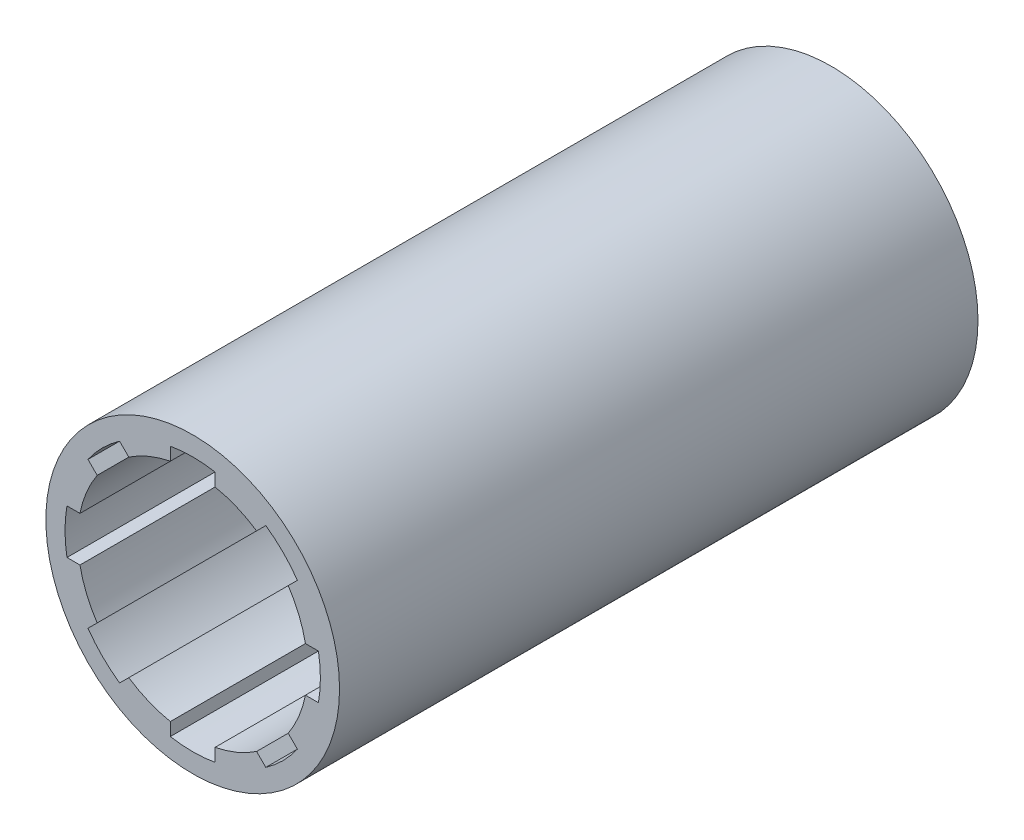
ISO-10303-21;
HEADER;
FILE_DESCRIPTION(('STEP AP214'),'2;1');
FILE_NAME('part.step','',(''),(''),'','','');
FILE_SCHEMA(('AUTOMOTIVE_DESIGN { 1 0 10303 214 1 1 1 1 }'));
ENDSEC;
DATA;
#1=APPLICATION_CONTEXT('core data for automotive mechanical design processes');
#2=APPLICATION_PROTOCOL_DEFINITION('international standard','automotive_design',2000,#1);
#3=PRODUCT_CONTEXT('',#1,'mechanical');
#4=PRODUCT('Part','Part','',(#3));
#5=PRODUCT_RELATED_PRODUCT_CATEGORY('part','',(#4));
#6=PRODUCT_DEFINITION_FORMATION('','',#4);
#7=PRODUCT_DEFINITION_CONTEXT('part definition',#1,'design');
#8=PRODUCT_DEFINITION('design','',#6,#7);
#9=PRODUCT_DEFINITION_SHAPE('','',#8);
#10=(LENGTH_UNIT() NAMED_UNIT(*) SI_UNIT(.MILLI.,.METRE.));
#11=(NAMED_UNIT(*) PLANE_ANGLE_UNIT() SI_UNIT($,.RADIAN.));
#12=(NAMED_UNIT(*) SI_UNIT($,.STERADIAN.) SOLID_ANGLE_UNIT());
#13=UNCERTAINTY_MEASURE_WITH_UNIT(LENGTH_MEASURE(1.E-05),#10,'distance_accuracy_value','');
#14=(GEOMETRIC_REPRESENTATION_CONTEXT(3) GLOBAL_UNCERTAINTY_ASSIGNED_CONTEXT((#13)) GLOBAL_UNIT_ASSIGNED_CONTEXT((#10,
#11,#12)) REPRESENTATION_CONTEXT('',''));
#15=CARTESIAN_POINT('',(0.,0.,0.));
#16=DIRECTION('',(0.,0.,1.));
#17=DIRECTION('',(1.,0.,0.));
#18=AXIS2_PLACEMENT_3D('',#15,#16,#17);
#19=CARTESIAN_POINT('',(0.,0.,100.));
#20=DIRECTION('',(0.,0.,-1.));
#21=DIRECTION('',(-1.,0.,0.));
#22=AXIS2_PLACEMENT_3D('',#19,#20,#21);
#23=CYLINDRICAL_SURFACE('',#22,20.);
#24=CARTESIAN_POINT('',(0.,0.,100.));
#25=DIRECTION('',(0.,0.,1.));
#26=DIRECTION('',(1.,0.,0.));
#27=AXIS2_PLACEMENT_3D('',#24,#25,#26);
#28=CIRCLE('',#27,20.);
#29=CARTESIAN_POINT('',(-19.6913686675158,3.49999999999676,100.));
#30=VERTEX_POINT('',#29);
#31=CARTESIAN_POINT('',(-19.6913686675153,-3.49999999999976,100.));
#32=VERTEX_POINT('',#31);
#33=EDGE_CURVE('E458',#30,#32,#28,.T.);
#34=ORIENTED_EDGE('',*,*,#33,.T.);
#35=DIRECTION('',(0.,0.,1.));
#36=VECTOR('',#35,1.);
#37=CARTESIAN_POINT('',(-19.6913686675153,-3.49999999999976,0.));
#38=LINE('',#37,#36);
#39=CARTESIAN_POINT('',(-19.6913686675153,-3.49999999999976,0.));
#40=VERTEX_POINT('',#39);
#41=EDGE_CURVE('E259',#40,#32,#38,.T.);
#42=ORIENTED_EDGE('',*,*,#41,.F.);
#43=CARTESIAN_POINT('',(0.,0.,0.));
#44=DIRECTION('',(0.,0.,1.));
#45=DIRECTION('',(1.,0.,0.));
#46=AXIS2_PLACEMENT_3D('',#43,#44,#45);
#47=CIRCLE('',#46,20.);
#48=CARTESIAN_POINT('',(-19.6913686675158,3.49999999999676,0.));
#49=VERTEX_POINT('',#48);
#50=EDGE_CURVE('E247',#49,#40,#47,.T.);
#51=ORIENTED_EDGE('',*,*,#50,.F.);
#52=DIRECTION('',(0.,0.,1.));
#53=VECTOR('',#52,1.);
#54=CARTESIAN_POINT('',(-19.6913686675158,3.49999999999676,0.));
#55=LINE('',#54,#53);
#56=EDGE_CURVE('E450',#49,#30,#55,.T.);
#57=ORIENTED_EDGE('',*,*,#56,.T.);
#58=EDGE_LOOP('',(#34,#42,#51,#57));
#59=FACE_BOUND('',#58,.T.);
#60=ADVANCED_FACE('F34',(#59),#23,.F.);
#61=DIRECTION('',(0.,0.,1.));
#62=VECTOR('',#61,1.);
#63=CARTESIAN_POINT('',(-16.3987740497953,-11.4490265814941,0.));
#64=LINE('',#63,#62);
#65=CARTESIAN_POINT('',(-16.3987740497953,-11.4490265814941,0.));
#66=VERTEX_POINT('',#65);
#67=CARTESIAN_POINT('',(-16.3987740497953,-11.4490265814941,100.));
#68=VERTEX_POINT('',#67);
#69=EDGE_CURVE('E274',#66,#68,#64,.T.);
#70=ORIENTED_EDGE('',*,*,#69,.T.);
#71=CARTESIAN_POINT('',(-11.4490265814916,-16.3987740497971,100.));
#72=VERTEX_POINT('',#71);
#73=EDGE_CURVE('E461',#68,#72,#28,.T.);
#74=ORIENTED_EDGE('',*,*,#73,.T.);
#75=DIRECTION('',(0.,0.,1.));
#76=VECTOR('',#75,1.);
#77=CARTESIAN_POINT('',(-11.4490265814916,-16.3987740497971,0.));
#78=LINE('',#77,#76);
#79=CARTESIAN_POINT('',(-11.4490265814916,-16.3987740497971,0.));
#80=VERTEX_POINT('',#79);
#81=EDGE_CURVE('E297',#80,#72,#78,.T.);
#82=ORIENTED_EDGE('',*,*,#81,.F.);
#83=EDGE_CURVE('E463',#66,#80,#47,.T.);
#84=ORIENTED_EDGE('',*,*,#83,.F.);
#85=EDGE_LOOP('',(#70,#74,#82,#84));
#86=FACE_BOUND('',#85,.T.);
#87=ADVANCED_FACE('F547',(#86),#23,.F.);
#88=DIRECTION('',(0.,0.,1.));
#89=VECTOR('',#88,1.);
#90=CARTESIAN_POINT('',(-3.49999999999676,-19.6913686675158,0.));
#91=LINE('',#90,#89);
#92=CARTESIAN_POINT('',(-3.49999999999676,-19.6913686675158,0.));
#93=VERTEX_POINT('',#92);
#94=CARTESIAN_POINT('',(-3.49999999999676,-19.6913686675158,100.));
#95=VERTEX_POINT('',#94);
#96=EDGE_CURVE('E294',#93,#95,#91,.T.);
#97=ORIENTED_EDGE('',*,*,#96,.T.);
#98=CARTESIAN_POINT('',(3.49999999999975,-19.6913686675153,100.));
#99=VERTEX_POINT('',#98);
#100=EDGE_CURVE('E491',#95,#99,#28,.T.);
#101=ORIENTED_EDGE('',*,*,#100,.T.);
#102=DIRECTION('',(0.,0.,1.));
#103=VECTOR('',#102,1.);
#104=CARTESIAN_POINT('',(3.49999999999975,-19.6913686675153,0.));
#105=LINE('',#104,#103);
#106=CARTESIAN_POINT('',(3.49999999999975,-19.6913686675153,0.));
#107=VERTEX_POINT('',#106);
#108=EDGE_CURVE('E323',#107,#99,#105,.T.);
#109=ORIENTED_EDGE('',*,*,#108,.F.);
#110=EDGE_CURVE('E465',#93,#107,#47,.T.);
#111=ORIENTED_EDGE('',*,*,#110,.F.);
#112=EDGE_LOOP('',(#97,#101,#109,#111));
#113=FACE_BOUND('',#112,.T.);
#114=ADVANCED_FACE('F489',(#113),#23,.F.);
#115=DIRECTION('',(0.,0.,1.));
#116=VECTOR('',#115,1.);
#117=CARTESIAN_POINT('',(11.4490265814941,-16.3987740497954,0.));
#118=LINE('',#117,#116);
#119=CARTESIAN_POINT('',(11.4490265814941,-16.3987740497954,0.));
#120=VERTEX_POINT('',#119);
#121=CARTESIAN_POINT('',(11.4490265814941,-16.3987740497954,100.));
#122=VERTEX_POINT('',#121);
#123=EDGE_CURVE('E320',#120,#122,#118,.T.);
#124=ORIENTED_EDGE('',*,*,#123,.T.);
#125=CARTESIAN_POINT('',(16.3987740497971,-11.4490265814916,100.));
#126=VERTEX_POINT('',#125);
#127=EDGE_CURVE('E493',#122,#126,#28,.T.);
#128=ORIENTED_EDGE('',*,*,#127,.T.);
#129=DIRECTION('',(0.,0.,1.));
#130=VECTOR('',#129,1.);
#131=CARTESIAN_POINT('',(16.3987740497971,-11.4490265814916,0.));
#132=LINE('',#131,#130);
#133=CARTESIAN_POINT('',(16.3987740497971,-11.4490265814916,0.));
#134=VERTEX_POINT('',#133);
#135=EDGE_CURVE('E349',#134,#126,#132,.T.);
#136=ORIENTED_EDGE('',*,*,#135,.F.);
#137=EDGE_CURVE('E475',#120,#134,#47,.T.);
#138=ORIENTED_EDGE('',*,*,#137,.F.);
#139=EDGE_LOOP('',(#124,#128,#136,#138));
#140=FACE_BOUND('',#139,.T.);
#141=ADVANCED_FACE('F597',(#140),#23,.F.);
#142=DIRECTION('',(0.,0.,1.));
#143=VECTOR('',#142,1.);
#144=CARTESIAN_POINT('',(19.6913686675158,-3.49999999999676,0.));
#145=LINE('',#144,#143);
#146=CARTESIAN_POINT('',(19.6913686675158,-3.49999999999676,0.));
#147=VERTEX_POINT('',#146);
#148=CARTESIAN_POINT('',(19.6913686675158,-3.49999999999676,100.));
#149=VERTEX_POINT('',#148);
#150=EDGE_CURVE('E346',#147,#149,#145,.T.);
#151=ORIENTED_EDGE('',*,*,#150,.T.);
#152=CARTESIAN_POINT('',(19.6913686675153,3.49999999999975,100.));
#153=VERTEX_POINT('',#152);
#154=EDGE_CURVE('E494',#149,#153,#28,.T.);
#155=ORIENTED_EDGE('',*,*,#154,.T.);
#156=DIRECTION('',(0.,0.,1.));
#157=VECTOR('',#156,1.);
#158=CARTESIAN_POINT('',(19.6913686675153,3.49999999999975,0.));
#159=LINE('',#158,#157);
#160=CARTESIAN_POINT('',(19.6913686675153,3.49999999999975,0.));
#161=VERTEX_POINT('',#160);
#162=EDGE_CURVE('E375',#161,#153,#159,.T.);
#163=ORIENTED_EDGE('',*,*,#162,.F.);
#164=EDGE_CURVE('E472',#147,#161,#47,.T.);
#165=ORIENTED_EDGE('',*,*,#164,.F.);
#166=EDGE_LOOP('',(#151,#155,#163,#165));
#167=FACE_BOUND('',#166,.T.);
#168=ADVANCED_FACE('F593',(#167),#23,.F.);
#169=DIRECTION('',(0.,0.,1.));
#170=VECTOR('',#169,1.);
#171=CARTESIAN_POINT('',(16.3987740497954,11.4490265814941,0.));
#172=LINE('',#171,#170);
#173=CARTESIAN_POINT('',(16.3987740497954,11.4490265814941,0.));
#174=VERTEX_POINT('',#173);
#175=CARTESIAN_POINT('',(16.3987740497954,11.4490265814941,100.));
#176=VERTEX_POINT('',#175);
#177=EDGE_CURVE('E372',#174,#176,#172,.T.);
#178=ORIENTED_EDGE('',*,*,#177,.T.);
#179=CARTESIAN_POINT('',(11.4490265814916,16.3987740497971,100.));
#180=VERTEX_POINT('',#179);
#181=EDGE_CURVE('E498',#176,#180,#28,.T.);
#182=ORIENTED_EDGE('',*,*,#181,.T.);
#183=DIRECTION('',(0.,0.,1.));
#184=VECTOR('',#183,1.);
#185=CARTESIAN_POINT('',(11.4490265814916,16.3987740497971,0.));
#186=LINE('',#185,#184);
#187=CARTESIAN_POINT('',(11.4490265814916,16.3987740497971,0.));
#188=VERTEX_POINT('',#187);
#189=EDGE_CURVE('E401',#188,#180,#186,.T.);
#190=ORIENTED_EDGE('',*,*,#189,.F.);
#191=EDGE_CURVE('E469',#174,#188,#47,.T.);
#192=ORIENTED_EDGE('',*,*,#191,.F.);
#193=EDGE_LOOP('',(#178,#182,#190,#192));
#194=FACE_BOUND('',#193,.T.);
#195=ADVANCED_FACE('F586',(#194),#23,.F.);
#196=DIRECTION('',(0.,0.,1.));
#197=VECTOR('',#196,1.);
#198=CARTESIAN_POINT('',(3.49999999999676,19.6913686675158,0.));
#199=LINE('',#198,#197);
#200=CARTESIAN_POINT('',(3.49999999999676,19.6913686675158,0.));
#201=VERTEX_POINT('',#200);
#202=CARTESIAN_POINT('',(3.49999999999676,19.6913686675158,100.));
#203=VERTEX_POINT('',#202);
#204=EDGE_CURVE('E398',#201,#203,#199,.T.);
#205=ORIENTED_EDGE('',*,*,#204,.T.);
#206=CARTESIAN_POINT('',(-3.49999999999975,19.6913686675153,100.));
#207=VERTEX_POINT('',#206);
#208=EDGE_CURVE('E464',#203,#207,#28,.T.);
#209=ORIENTED_EDGE('',*,*,#208,.T.);
#210=DIRECTION('',(0.,0.,1.));
#211=VECTOR('',#210,1.);
#212=CARTESIAN_POINT('',(-3.49999999999975,19.6913686675153,0.));
#213=LINE('',#212,#211);
#214=CARTESIAN_POINT('',(-3.49999999999975,19.6913686675153,0.));
#215=VERTEX_POINT('',#214);
#216=EDGE_CURVE('E427',#215,#207,#213,.T.);
#217=ORIENTED_EDGE('',*,*,#216,.F.);
#218=EDGE_CURVE('E466',#201,#215,#47,.T.);
#219=ORIENTED_EDGE('',*,*,#218,.F.);
#220=EDGE_LOOP('',(#205,#209,#217,#219));
#221=FACE_BOUND('',#220,.T.);
#222=ADVANCED_FACE('F507',(#221),#23,.F.);
#223=CARTESIAN_POINT('',(0.,0.,100.));
#224=DIRECTION('',(0.,0.,1.));
#225=DIRECTION('',(1.,0.,0.));
#226=AXIS2_PLACEMENT_3D('',#223,#224,#225);
#227=PLANE('',#226);
#228=CARTESIAN_POINT('',(0.,0.,100.));
#229=DIRECTION('',(0.,0.,1.));
#230=DIRECTION('',(1.,0.,0.));
#231=AXIS2_PLACEMENT_3D('',#228,#229,#230);
#232=CIRCLE('',#231,23.);
#233=CARTESIAN_POINT('',(23.,0.,100.));
#234=VERTEX_POINT('',#233);
#235=EDGE_CURVE('E11',#234,#234,#232,.T.);
#236=ORIENTED_EDGE('',*,*,#235,.T.);
#237=EDGE_LOOP('',(#236));
#238=FACE_BOUND('',#237,.T.);
#239=ORIENTED_EDGE('',*,*,#33,.F.);
#240=DIRECTION('',(1.,0.,0.));
#241=VECTOR('',#240,1.);
#242=CARTESIAN_POINT('',(0.,3.49999999999677,100.));
#243=LINE('',#242,#241);
#244=CARTESIAN_POINT('',(-17.6564435830091,3.49999999999676,100.));
#245=VERTEX_POINT('',#244);
#246=EDGE_CURVE('E435',#30,#245,#243,.T.);
#247=ORIENTED_EDGE('',*,*,#246,.T.);
#248=CARTESIAN_POINT('',(0.,0.,100.));
#249=DIRECTION('',(0.,0.,1.));
#250=DIRECTION('',(1.,0.,0.));
#251=AXIS2_PLACEMENT_3D('',#248,#249,#250);
#252=CIRCLE('',#251,17.9999999999989);
#253=CARTESIAN_POINT('',(-14.9598647233358,10.0101172550303,100.));
#254=VERTEX_POINT('',#253);
#255=EDGE_CURVE('E423',#254,#245,#252,.T.);
#256=ORIENTED_EDGE('',*,*,#255,.F.);
#257=DIRECTION('',(0.707106781186548,-0.707106781186547,0.));
#258=VECTOR('',#257,1.);
#259=CARTESIAN_POINT('',(-2.47487373415274,-2.47487373415274,100.));
#260=LINE('',#259,#258);
#261=CARTESIAN_POINT('',(-16.3987740497971,11.4490265814916,100.));
#262=VERTEX_POINT('',#261);
#263=EDGE_CURVE('E443',#262,#254,#260,.T.);
#264=ORIENTED_EDGE('',*,*,#263,.F.);
#265=CARTESIAN_POINT('',(-11.4490265814941,16.3987740497954,100.));
#266=VERTEX_POINT('',#265);
#267=EDGE_CURVE('E462',#266,#262,#28,.T.);
#268=ORIENTED_EDGE('',*,*,#267,.F.);
#269=DIRECTION('',(0.707106781186548,-0.707106781186547,0.));
#270=VECTOR('',#269,1.);
#271=CARTESIAN_POINT('',(2.47487373415063,2.47487373415063,100.));
#272=LINE('',#271,#270);
#273=CARTESIAN_POINT('',(-10.0101172550328,14.9598647233341,100.));
#274=VERTEX_POINT('',#273);
#275=EDGE_CURVE('E409',#266,#274,#272,.T.);
#276=ORIENTED_EDGE('',*,*,#275,.T.);
#277=CARTESIAN_POINT('',(0.,0.,100.));
#278=DIRECTION('',(0.,0.,1.));
#279=DIRECTION('',(1.,0.,0.));
#280=AXIS2_PLACEMENT_3D('',#277,#278,#279);
#281=CIRCLE('',#280,17.9999999999989);
#282=CARTESIAN_POINT('',(-3.49999999999975,17.6564435830085,100.));
#283=VERTEX_POINT('',#282);
#284=EDGE_CURVE('E397',#283,#274,#281,.T.);
#285=ORIENTED_EDGE('',*,*,#284,.F.);
#286=DIRECTION('',(0.,-1.,0.));
#287=VECTOR('',#286,1.);
#288=CARTESIAN_POINT('',(-3.49999999999975,0.,100.));
#289=LINE('',#288,#287);
#290=EDGE_CURVE('E417',#207,#283,#289,.T.);
#291=ORIENTED_EDGE('',*,*,#290,.F.);
#292=ORIENTED_EDGE('',*,*,#208,.F.);
#293=DIRECTION('',(0.,-1.,0.));
#294=VECTOR('',#293,1.);
#295=CARTESIAN_POINT('',(3.49999999999677,0.,100.));
#296=LINE('',#295,#294);
#297=CARTESIAN_POINT('',(3.49999999999676,17.6564435830091,100.));
#298=VERTEX_POINT('',#297);
#299=EDGE_CURVE('E383',#203,#298,#296,.T.);
#300=ORIENTED_EDGE('',*,*,#299,.T.);
#301=CARTESIAN_POINT('',(0.,0.,100.));
#302=DIRECTION('',(0.,0.,1.));
#303=DIRECTION('',(1.,0.,0.));
#304=AXIS2_PLACEMENT_3D('',#301,#302,#303);
#305=CIRCLE('',#304,17.9999999999989);
#306=CARTESIAN_POINT('',(10.0101172550303,14.9598647233358,100.));
#307=VERTEX_POINT('',#306);
#308=EDGE_CURVE('E371',#307,#298,#305,.T.);
#309=ORIENTED_EDGE('',*,*,#308,.F.);
#310=DIRECTION('',(-0.707106781186547,-0.707106781186548,0.));
#311=VECTOR('',#310,1.);
#312=CARTESIAN_POINT('',(-2.47487373415274,2.47487373415273,100.));
#313=LINE('',#312,#311);
#314=EDGE_CURVE('E391',#180,#307,#313,.T.);
#315=ORIENTED_EDGE('',*,*,#314,.F.);
#316=ORIENTED_EDGE('',*,*,#181,.F.);
#317=DIRECTION('',(-0.707106781186547,-0.707106781186548,0.));
#318=VECTOR('',#317,1.);
#319=CARTESIAN_POINT('',(2.47487373415065,-2.47487373415064,100.));
#320=LINE('',#319,#318);
#321=CARTESIAN_POINT('',(14.9598647233341,10.0101172550328,100.));
#322=VERTEX_POINT('',#321);
#323=EDGE_CURVE('E357',#176,#322,#320,.T.);
#324=ORIENTED_EDGE('',*,*,#323,.T.);
#325=CARTESIAN_POINT('',(0.,0.,100.));
#326=DIRECTION('',(0.,0.,1.));
#327=DIRECTION('',(1.,0.,0.));
#328=AXIS2_PLACEMENT_3D('',#325,#326,#327);
#329=CIRCLE('',#328,17.9999999999989);
#330=CARTESIAN_POINT('',(17.6564435830085,3.49999999999975,100.));
#331=VERTEX_POINT('',#330);
#332=EDGE_CURVE('E345',#331,#322,#329,.T.);
#333=ORIENTED_EDGE('',*,*,#332,.F.);
#334=DIRECTION('',(-1.,0.,0.));
#335=VECTOR('',#334,1.);
#336=CARTESIAN_POINT('',(0.,3.49999999999975,100.));
#337=LINE('',#336,#335);
#338=EDGE_CURVE('E365',#153,#331,#337,.T.);
#339=ORIENTED_EDGE('',*,*,#338,.F.);
#340=ORIENTED_EDGE('',*,*,#154,.F.);
#341=DIRECTION('',(-1.,0.,0.));
#342=VECTOR('',#341,1.);
#343=CARTESIAN_POINT('',(0.,-3.49999999999677,100.));
#344=LINE('',#343,#342);
#345=CARTESIAN_POINT('',(17.6564435830091,-3.49999999999676,100.));
#346=VERTEX_POINT('',#345);
#347=EDGE_CURVE('E331',#149,#346,#344,.T.);
#348=ORIENTED_EDGE('',*,*,#347,.T.);
#349=CARTESIAN_POINT('',(0.,0.,100.));
#350=DIRECTION('',(0.,0.,1.));
#351=DIRECTION('',(1.,0.,0.));
#352=AXIS2_PLACEMENT_3D('',#349,#350,#351);
#353=CIRCLE('',#352,17.9999999999989);
#354=CARTESIAN_POINT('',(14.9598647233358,-10.0101172550303,100.));
#355=VERTEX_POINT('',#354);
#356=EDGE_CURVE('E319',#355,#346,#353,.T.);
#357=ORIENTED_EDGE('',*,*,#356,.F.);
#358=DIRECTION('',(-0.707106781186548,0.707106781186547,0.));
#359=VECTOR('',#358,1.);
#360=CARTESIAN_POINT('',(2.47487373415272,2.47487373415273,100.));
#361=LINE('',#360,#359);
#362=EDGE_CURVE('E339',#126,#355,#361,.T.);
#363=ORIENTED_EDGE('',*,*,#362,.F.);
#364=ORIENTED_EDGE('',*,*,#127,.F.);
#365=DIRECTION('',(-0.707106781186548,0.707106781186547,0.));
#366=VECTOR('',#365,1.);
#367=CARTESIAN_POINT('',(-2.47487373415064,-2.47487373415065,100.));
#368=LINE('',#367,#366);
#369=CARTESIAN_POINT('',(10.0101172550328,-14.9598647233341,100.));
#370=VERTEX_POINT('',#369);
#371=EDGE_CURVE('E305',#122,#370,#368,.T.);
#372=ORIENTED_EDGE('',*,*,#371,.T.);
#373=CARTESIAN_POINT('',(0.,0.,100.));
#374=DIRECTION('',(0.,0.,1.));
#375=DIRECTION('',(1.,0.,0.));
#376=AXIS2_PLACEMENT_3D('',#373,#374,#375);
#377=CIRCLE('',#376,17.9999999999989);
#378=CARTESIAN_POINT('',(3.49999999999975,-17.6564435830085,100.));
#379=VERTEX_POINT('',#378);
#380=EDGE_CURVE('E293',#379,#370,#377,.T.);
#381=ORIENTED_EDGE('',*,*,#380,.F.);
#382=DIRECTION('',(0.,1.,0.));
#383=VECTOR('',#382,1.);
#384=CARTESIAN_POINT('',(3.49999999999975,0.,100.));
#385=LINE('',#384,#383);
#386=EDGE_CURVE('E313',#99,#379,#385,.T.);
#387=ORIENTED_EDGE('',*,*,#386,.F.);
#388=ORIENTED_EDGE('',*,*,#100,.F.);
#389=DIRECTION('',(0.,1.,0.));
#390=VECTOR('',#389,1.);
#391=CARTESIAN_POINT('',(-3.49999999999676,0.,100.));
#392=LINE('',#391,#390);
#393=CARTESIAN_POINT('',(-3.49999999999676,-17.6564435830091,100.));
#394=VERTEX_POINT('',#393);
#395=EDGE_CURVE('E281',#95,#394,#392,.T.);
#396=ORIENTED_EDGE('',*,*,#395,.T.);
#397=CARTESIAN_POINT('',(0.,0.,100.));
#398=DIRECTION('',(0.,0.,1.));
#399=DIRECTION('',(1.,0.,0.));
#400=AXIS2_PLACEMENT_3D('',#397,#398,#399);
#401=CIRCLE('',#400,17.9999999999989);
#402=CARTESIAN_POINT('',(-10.0101172550303,-14.9598647233358,100.));
#403=VERTEX_POINT('',#402);
#404=EDGE_CURVE('E273',#403,#394,#401,.T.);
#405=ORIENTED_EDGE('',*,*,#404,.F.);
#406=DIRECTION('',(0.707106781186547,0.707106781186548,0.));
#407=VECTOR('',#406,1.);
#408=CARTESIAN_POINT('',(2.47487373415273,-2.47487373415272,100.));
#409=LINE('',#408,#407);
#410=EDGE_CURVE('E287',#72,#403,#409,.T.);
#411=ORIENTED_EDGE('',*,*,#410,.F.);
#412=ORIENTED_EDGE('',*,*,#73,.F.);
#413=DIRECTION('',(0.707106781186546,0.707106781186549,0.));
#414=VECTOR('',#413,1.);
#415=CARTESIAN_POINT('',(-2.47487373415065,2.47487373415064,100.));
#416=LINE('',#415,#414);
#417=CARTESIAN_POINT('',(-14.9598647233341,-10.0101172550328,100.));
#418=VERTEX_POINT('',#417);
#419=EDGE_CURVE('E263',#68,#418,#416,.T.);
#420=ORIENTED_EDGE('',*,*,#419,.T.);
#421=CARTESIAN_POINT('',(0.,0.,100.));
#422=DIRECTION('',(0.,0.,1.));
#423=DIRECTION('',(1.,0.,0.));
#424=AXIS2_PLACEMENT_3D('',#421,#422,#423);
#425=CIRCLE('',#424,17.9999999999989);
#426=CARTESIAN_POINT('',(-17.6564435830085,-3.49999999999975,100.));
#427=VERTEX_POINT('',#426);
#428=EDGE_CURVE('E269',#427,#418,#425,.T.);
#429=ORIENTED_EDGE('',*,*,#428,.F.);
#430=DIRECTION('',(1.,0.,0.));
#431=VECTOR('',#430,1.);
#432=CARTESIAN_POINT('',(0.,-3.49999999999975,100.));
#433=LINE('',#432,#431);
#434=EDGE_CURVE('E255',#32,#427,#433,.T.);
#435=ORIENTED_EDGE('',*,*,#434,.F.);
#436=EDGE_LOOP('',(#239,#247,#256,#264,#268,#276,#285,#291,#292,#300,#309,#315,#316,#324,#333,
#339,#340,#348,#357,#363,#364,#372,#381,#387,#388,#396,#405,#411,#412,#420,#429,#435));
#437=FACE_BOUND('',#436,.T.);
#438=ADVANCED_FACE('F515',(#238,#437),#227,.T.);
#439=CARTESIAN_POINT('',(0.,0.,0.));
#440=DIRECTION('',(0.,0.,1.));
#441=DIRECTION('',(1.,0.,0.));
#442=AXIS2_PLACEMENT_3D('',#439,#440,#441);
#443=PLANE('',#442);
#444=CARTESIAN_POINT('',(0.,0.,0.));
#445=DIRECTION('',(0.,0.,1.));
#446=DIRECTION('',(1.,0.,0.));
#447=AXIS2_PLACEMENT_3D('',#444,#445,#446);
#448=CIRCLE('',#447,23.);
#449=CARTESIAN_POINT('',(23.,0.,0.));
#450=VERTEX_POINT('',#449);
#451=EDGE_CURVE('E38',#450,#450,#448,.T.);
#452=ORIENTED_EDGE('',*,*,#451,.F.);
#453=EDGE_LOOP('',(#452));
#454=FACE_BOUND('',#453,.T.);
#455=ORIENTED_EDGE('',*,*,#50,.T.);
#456=DIRECTION('',(1.,0.,0.));
#457=VECTOR('',#456,1.);
#458=CARTESIAN_POINT('',(0.,-3.49999999999975,0.));
#459=LINE('',#458,#457);
#460=CARTESIAN_POINT('',(-17.6564435830085,-3.49999999999975,0.));
#461=VERTEX_POINT('',#460);
#462=EDGE_CURVE('E240',#40,#461,#459,.T.);
#463=ORIENTED_EDGE('',*,*,#462,.T.);
#464=CARTESIAN_POINT('',(0.,0.,0.));
#465=DIRECTION('',(0.,0.,1.));
#466=DIRECTION('',(1.,0.,0.));
#467=AXIS2_PLACEMENT_3D('',#464,#465,#466);
#468=CIRCLE('',#467,17.9999999999989);
#469=CARTESIAN_POINT('',(-14.9598647233341,-10.0101172550328,0.));
#470=VERTEX_POINT('',#469);
#471=EDGE_CURVE('E244',#461,#470,#468,.T.);
#472=ORIENTED_EDGE('',*,*,#471,.T.);
#473=DIRECTION('',(0.707106781186546,0.707106781186549,0.));
#474=VECTOR('',#473,1.);
#475=CARTESIAN_POINT('',(-2.47487373415065,2.47487373415064,0.));
#476=LINE('',#475,#474);
#477=EDGE_CURVE('E49',#66,#470,#476,.T.);
#478=ORIENTED_EDGE('',*,*,#477,.F.);
#479=ORIENTED_EDGE('',*,*,#83,.T.);
#480=DIRECTION('',(0.707106781186547,0.707106781186548,0.));
#481=VECTOR('',#480,1.);
#482=CARTESIAN_POINT('',(2.47487373415273,-2.47487373415272,0.));
#483=LINE('',#482,#481);
#484=CARTESIAN_POINT('',(-10.0101172550303,-14.9598647233358,0.));
#485=VERTEX_POINT('',#484);
#486=EDGE_CURVE('E280',#80,#485,#483,.T.);
#487=ORIENTED_EDGE('',*,*,#486,.T.);
#488=CARTESIAN_POINT('',(0.,0.,0.));
#489=DIRECTION('',(0.,0.,1.));
#490=DIRECTION('',(1.,0.,0.));
#491=AXIS2_PLACEMENT_3D('',#488,#489,#490);
#492=CIRCLE('',#491,17.9999999999989);
#493=CARTESIAN_POINT('',(-3.49999999999676,-17.6564435830091,0.));
#494=VERTEX_POINT('',#493);
#495=EDGE_CURVE('E278',#485,#494,#492,.T.);
#496=ORIENTED_EDGE('',*,*,#495,.T.);
#497=DIRECTION('',(0.,1.,0.));
#498=VECTOR('',#497,1.);
#499=CARTESIAN_POINT('',(-3.49999999999676,0.,0.));
#500=LINE('',#499,#498);
#501=EDGE_CURVE('E56',#93,#494,#500,.T.);
#502=ORIENTED_EDGE('',*,*,#501,.F.);
#503=ORIENTED_EDGE('',*,*,#110,.T.);
#504=DIRECTION('',(0.,1.,0.));
#505=VECTOR('',#504,1.);
#506=CARTESIAN_POINT('',(3.49999999999975,0.,0.));
#507=LINE('',#506,#505);
#508=CARTESIAN_POINT('',(3.49999999999975,-17.6564435830085,0.));
#509=VERTEX_POINT('',#508);
#510=EDGE_CURVE('E304',#107,#509,#507,.T.);
#511=ORIENTED_EDGE('',*,*,#510,.T.);
#512=CARTESIAN_POINT('',(0.,0.,0.));
#513=DIRECTION('',(0.,0.,1.));
#514=DIRECTION('',(1.,0.,0.));
#515=AXIS2_PLACEMENT_3D('',#512,#513,#514);
#516=CIRCLE('',#515,17.9999999999989);
#517=CARTESIAN_POINT('',(10.0101172550328,-14.9598647233341,0.));
#518=VERTEX_POINT('',#517);
#519=EDGE_CURVE('E302',#509,#518,#516,.T.);
#520=ORIENTED_EDGE('',*,*,#519,.T.);
#521=DIRECTION('',(-0.707106781186548,0.707106781186547,0.));
#522=VECTOR('',#521,1.);
#523=CARTESIAN_POINT('',(-2.47487373415064,-2.47487373415065,0.));
#524=LINE('',#523,#522);
#525=EDGE_CURVE('E307',#120,#518,#524,.T.);
#526=ORIENTED_EDGE('',*,*,#525,.F.);
#527=ORIENTED_EDGE('',*,*,#137,.T.);
#528=DIRECTION('',(-0.707106781186548,0.707106781186547,0.));
#529=VECTOR('',#528,1.);
#530=CARTESIAN_POINT('',(2.47487373415272,2.47487373415273,0.));
#531=LINE('',#530,#529);
#532=CARTESIAN_POINT('',(14.9598647233358,-10.0101172550303,0.));
#533=VERTEX_POINT('',#532);
#534=EDGE_CURVE('E330',#134,#533,#531,.T.);
#535=ORIENTED_EDGE('',*,*,#534,.T.);
#536=CARTESIAN_POINT('',(0.,0.,0.));
#537=DIRECTION('',(0.,0.,1.));
#538=DIRECTION('',(1.,0.,0.));
#539=AXIS2_PLACEMENT_3D('',#536,#537,#538);
#540=CIRCLE('',#539,17.9999999999989);
#541=CARTESIAN_POINT('',(17.6564435830091,-3.49999999999676,0.));
#542=VERTEX_POINT('',#541);
#543=EDGE_CURVE('E328',#533,#542,#540,.T.);
#544=ORIENTED_EDGE('',*,*,#543,.T.);
#545=DIRECTION('',(-1.,0.,0.));
#546=VECTOR('',#545,1.);
#547=CARTESIAN_POINT('',(0.,-3.49999999999677,0.));
#548=LINE('',#547,#546);
#549=EDGE_CURVE('E333',#147,#542,#548,.T.);
#550=ORIENTED_EDGE('',*,*,#549,.F.);
#551=ORIENTED_EDGE('',*,*,#164,.T.);
#552=DIRECTION('',(-1.,0.,0.));
#553=VECTOR('',#552,1.);
#554=CARTESIAN_POINT('',(0.,3.49999999999975,0.));
#555=LINE('',#554,#553);
#556=CARTESIAN_POINT('',(17.6564435830085,3.49999999999975,0.));
#557=VERTEX_POINT('',#556);
#558=EDGE_CURVE('E356',#161,#557,#555,.T.);
#559=ORIENTED_EDGE('',*,*,#558,.T.);
#560=CARTESIAN_POINT('',(0.,0.,0.));
#561=DIRECTION('',(0.,0.,1.));
#562=DIRECTION('',(1.,0.,0.));
#563=AXIS2_PLACEMENT_3D('',#560,#561,#562);
#564=CIRCLE('',#563,17.9999999999989);
#565=CARTESIAN_POINT('',(14.9598647233341,10.0101172550328,0.));
#566=VERTEX_POINT('',#565);
#567=EDGE_CURVE('E354',#557,#566,#564,.T.);
#568=ORIENTED_EDGE('',*,*,#567,.T.);
#569=DIRECTION('',(-0.707106781186547,-0.707106781186548,0.));
#570=VECTOR('',#569,1.);
#571=CARTESIAN_POINT('',(2.47487373415065,-2.47487373415064,0.));
#572=LINE('',#571,#570);
#573=EDGE_CURVE('E359',#174,#566,#572,.T.);
#574=ORIENTED_EDGE('',*,*,#573,.F.);
#575=ORIENTED_EDGE('',*,*,#191,.T.);
#576=DIRECTION('',(-0.707106781186547,-0.707106781186548,0.));
#577=VECTOR('',#576,1.);
#578=CARTESIAN_POINT('',(-2.47487373415274,2.47487373415273,0.));
#579=LINE('',#578,#577);
#580=CARTESIAN_POINT('',(10.0101172550303,14.9598647233358,0.));
#581=VERTEX_POINT('',#580);
#582=EDGE_CURVE('E382',#188,#581,#579,.T.);
#583=ORIENTED_EDGE('',*,*,#582,.T.);
#584=CARTESIAN_POINT('',(0.,0.,0.));
#585=DIRECTION('',(0.,0.,1.));
#586=DIRECTION('',(1.,0.,0.));
#587=AXIS2_PLACEMENT_3D('',#584,#585,#586);
#588=CIRCLE('',#587,17.9999999999989);
#589=CARTESIAN_POINT('',(3.49999999999676,17.6564435830091,0.));
#590=VERTEX_POINT('',#589);
#591=EDGE_CURVE('E380',#581,#590,#588,.T.);
#592=ORIENTED_EDGE('',*,*,#591,.T.);
#593=DIRECTION('',(0.,-1.,0.));
#594=VECTOR('',#593,1.);
#595=CARTESIAN_POINT('',(3.49999999999677,0.,0.));
#596=LINE('',#595,#594);
#597=EDGE_CURVE('E385',#201,#590,#596,.T.);
#598=ORIENTED_EDGE('',*,*,#597,.F.);
#599=ORIENTED_EDGE('',*,*,#218,.T.);
#600=DIRECTION('',(0.,-1.,0.));
#601=VECTOR('',#600,1.);
#602=CARTESIAN_POINT('',(-3.49999999999975,0.,0.));
#603=LINE('',#602,#601);
#604=CARTESIAN_POINT('',(-3.49999999999975,17.6564435830085,0.));
#605=VERTEX_POINT('',#604);
#606=EDGE_CURVE('E408',#215,#605,#603,.T.);
#607=ORIENTED_EDGE('',*,*,#606,.T.);
#608=CARTESIAN_POINT('',(0.,0.,0.));
#609=DIRECTION('',(0.,0.,1.));
#610=DIRECTION('',(1.,0.,0.));
#611=AXIS2_PLACEMENT_3D('',#608,#609,#610);
#612=CIRCLE('',#611,17.9999999999989);
#613=CARTESIAN_POINT('',(-10.0101172550328,14.9598647233341,0.));
#614=VERTEX_POINT('',#613);
#615=EDGE_CURVE('E406',#605,#614,#612,.T.);
#616=ORIENTED_EDGE('',*,*,#615,.T.);
#617=DIRECTION('',(0.707106781186548,-0.707106781186547,0.));
#618=VECTOR('',#617,1.);
#619=CARTESIAN_POINT('',(2.47487373415063,2.47487373415063,0.));
#620=LINE('',#619,#618);
#621=CARTESIAN_POINT('',(-11.4490265814941,16.3987740497954,0.));
#622=VERTEX_POINT('',#621);
#623=EDGE_CURVE('E411',#622,#614,#620,.T.);
#624=ORIENTED_EDGE('',*,*,#623,.F.);
#625=CARTESIAN_POINT('',(-16.3987740497971,11.4490265814916,0.));
#626=VERTEX_POINT('',#625);
#627=EDGE_CURVE('E449',#622,#626,#47,.T.);
#628=ORIENTED_EDGE('',*,*,#627,.T.);
#629=DIRECTION('',(0.707106781186548,-0.707106781186547,0.));
#630=VECTOR('',#629,1.);
#631=CARTESIAN_POINT('',(-2.47487373415274,-2.47487373415274,0.));
#632=LINE('',#631,#630);
#633=CARTESIAN_POINT('',(-14.9598647233358,10.0101172550303,0.));
#634=VERTEX_POINT('',#633);
#635=EDGE_CURVE('E434',#626,#634,#632,.T.);
#636=ORIENTED_EDGE('',*,*,#635,.T.);
#637=CARTESIAN_POINT('',(0.,0.,0.));
#638=DIRECTION('',(0.,0.,1.));
#639=DIRECTION('',(1.,0.,0.));
#640=AXIS2_PLACEMENT_3D('',#637,#638,#639);
#641=CIRCLE('',#640,17.9999999999989);
#642=CARTESIAN_POINT('',(-17.6564435830091,3.49999999999676,0.));
#643=VERTEX_POINT('',#642);
#644=EDGE_CURVE('E432',#634,#643,#641,.T.);
#645=ORIENTED_EDGE('',*,*,#644,.T.);
#646=DIRECTION('',(1.,0.,0.));
#647=VECTOR('',#646,1.);
#648=CARTESIAN_POINT('',(0.,3.49999999999677,0.));
#649=LINE('',#648,#647);
#650=EDGE_CURVE('E437',#49,#643,#649,.T.);
#651=ORIENTED_EDGE('',*,*,#650,.F.);
#652=EDGE_LOOP('',(#455,#463,#472,#478,#479,#487,#496,#502,#503,#511,#520,#526,#527,#535,#544,
#550,#551,#559,#568,#574,#575,#583,#592,#598,#599,#607,#616,#624,#628,#636,#645,#651));
#653=FACE_BOUND('',#652,.T.);
#654=ADVANCED_FACE('F242',(#454,#653),#443,.F.);
#655=CARTESIAN_POINT('',(0.,0.,100.));
#656=DIRECTION('',(0.,0.,-1.));
#657=DIRECTION('',(-1.,0.,0.));
#658=AXIS2_PLACEMENT_3D('',#655,#656,#657);
#659=CYLINDRICAL_SURFACE('',#658,23.);
#660=ORIENTED_EDGE('',*,*,#235,.F.);
#661=EDGE_LOOP('',(#660));
#662=FACE_BOUND('',#661,.T.);
#663=ORIENTED_EDGE('',*,*,#451,.T.);
#664=EDGE_LOOP('',(#663));
#665=FACE_BOUND('',#664,.T.);
#666=ADVANCED_FACE('F36',(#662,#665),#659,.T.);
#667=DIRECTION('',(0.,0.,1.));
#668=VECTOR('',#667,1.);
#669=CARTESIAN_POINT('',(-11.4490265814941,16.3987740497954,0.));
#670=LINE('',#669,#668);
#671=EDGE_CURVE('E424',#622,#266,#670,.T.);
#672=ORIENTED_EDGE('',*,*,#671,.T.);
#673=ORIENTED_EDGE('',*,*,#267,.T.);
#674=DIRECTION('',(0.,0.,1.));
#675=VECTOR('',#674,1.);
#676=CARTESIAN_POINT('',(-16.3987740497971,11.4490265814916,0.));
#677=LINE('',#676,#675);
#678=EDGE_CURVE('E453',#626,#262,#677,.T.);
#679=ORIENTED_EDGE('',*,*,#678,.F.);
#680=ORIENTED_EDGE('',*,*,#627,.F.);
#681=EDGE_LOOP('',(#672,#673,#679,#680));
#682=FACE_BOUND('',#681,.T.);
#683=ADVANCED_FACE('F525',(#682),#23,.F.);
#684=CARTESIAN_POINT('',(0.,0.,0.));
#685=DIRECTION('',(0.,0.,1.));
#686=DIRECTION('',(1.,0.,0.));
#687=AXIS2_PLACEMENT_3D('',#684,#685,#686);
#688=CYLINDRICAL_SURFACE('',#687,17.9999999999989);
#689=ORIENTED_EDGE('',*,*,#255,.T.);
#690=DIRECTION('',(0.,0.,1.));
#691=VECTOR('',#690,1.);
#692=CARTESIAN_POINT('',(-17.6564435830091,3.49999999999676,0.));
#693=LINE('',#692,#691);
#694=EDGE_CURVE('E447',#643,#245,#693,.T.);
#695=ORIENTED_EDGE('',*,*,#694,.F.);
#696=ORIENTED_EDGE('',*,*,#644,.F.);
#697=DIRECTION('',(0.,0.,1.));
#698=VECTOR('',#697,1.);
#699=CARTESIAN_POINT('',(-14.9598647233358,10.0101172550303,0.));
#700=LINE('',#699,#698);
#701=EDGE_CURVE('E440',#634,#254,#700,.T.);
#702=ORIENTED_EDGE('',*,*,#701,.T.);
#703=EDGE_LOOP('',(#689,#695,#696,#702));
#704=FACE_BOUND('',#703,.T.);
#705=ADVANCED_FACE('F534',(#704),#688,.F.);
#706=CARTESIAN_POINT('',(0.,3.49999999999677,0.));
#707=DIRECTION('',(0.,-1.,0.));
#708=DIRECTION('',(1.,0.,0.));
#709=AXIS2_PLACEMENT_3D('',#706,#707,#708);
#710=PLANE('',#709);
#711=ORIENTED_EDGE('',*,*,#246,.F.);
#712=ORIENTED_EDGE('',*,*,#56,.F.);
#713=ORIENTED_EDGE('',*,*,#650,.T.);
#714=ORIENTED_EDGE('',*,*,#694,.T.);
#715=EDGE_LOOP('',(#711,#712,#713,#714));
#716=FACE_BOUND('',#715,.T.);
#717=ADVANCED_FACE('F539',(#716),#710,.T.);
#718=CARTESIAN_POINT('',(-2.47487373415274,-2.47487373415274,0.));
#719=DIRECTION('',(-0.707106781186547,-0.707106781186548,0.));
#720=DIRECTION('',(0.707106781186548,-0.707106781186547,0.));
#721=AXIS2_PLACEMENT_3D('',#718,#719,#720);
#722=PLANE('',#721);
#723=ORIENTED_EDGE('',*,*,#263,.T.);
#724=ORIENTED_EDGE('',*,*,#701,.F.);
#725=ORIENTED_EDGE('',*,*,#635,.F.);
#726=ORIENTED_EDGE('',*,*,#678,.T.);
#727=EDGE_LOOP('',(#723,#724,#725,#726));
#728=FACE_BOUND('',#727,.T.);
#729=ADVANCED_FACE('F530',(#728),#722,.F.);
#730=CARTESIAN_POINT('',(0.,0.,0.));
#731=DIRECTION('',(0.,0.,1.));
#732=DIRECTION('',(1.,0.,0.));
#733=AXIS2_PLACEMENT_3D('',#730,#731,#732);
#734=CYLINDRICAL_SURFACE('',#733,17.9999999999989);
#735=ORIENTED_EDGE('',*,*,#284,.T.);
#736=DIRECTION('',(0.,0.,1.));
#737=VECTOR('',#736,1.);
#738=CARTESIAN_POINT('',(-10.0101172550328,14.9598647233341,0.));
#739=LINE('',#738,#737);
#740=EDGE_CURVE('E421',#614,#274,#739,.T.);
#741=ORIENTED_EDGE('',*,*,#740,.F.);
#742=ORIENTED_EDGE('',*,*,#615,.F.);
#743=DIRECTION('',(0.,0.,1.));
#744=VECTOR('',#743,1.);
#745=CARTESIAN_POINT('',(-3.49999999999975,17.6564435830085,0.));
#746=LINE('',#745,#744);
#747=EDGE_CURVE('E414',#605,#283,#746,.T.);
#748=ORIENTED_EDGE('',*,*,#747,.T.);
#749=EDGE_LOOP('',(#735,#741,#742,#748));
#750=FACE_BOUND('',#749,.T.);
#751=ADVANCED_FACE('F519',(#750),#734,.F.);
#752=CARTESIAN_POINT('',(2.47487373415063,2.47487373415063,0.));
#753=DIRECTION('',(-0.707106781186547,-0.707106781186548,0.));
#754=DIRECTION('',(0.707106781186548,-0.707106781186547,0.));
#755=AXIS2_PLACEMENT_3D('',#752,#753,#754);
#756=PLANE('',#755);
#757=ORIENTED_EDGE('',*,*,#275,.F.);
#758=ORIENTED_EDGE('',*,*,#671,.F.);
#759=ORIENTED_EDGE('',*,*,#623,.T.);
#760=ORIENTED_EDGE('',*,*,#740,.T.);
#761=EDGE_LOOP('',(#757,#758,#759,#760));
#762=FACE_BOUND('',#761,.T.);
#763=ADVANCED_FACE('F523',(#762),#756,.T.);
#764=CARTESIAN_POINT('',(-3.49999999999975,0.,0.));
#765=DIRECTION('',(-1.,0.,0.));
#766=DIRECTION('',(0.,-1.,0.));
#767=AXIS2_PLACEMENT_3D('',#764,#765,#766);
#768=PLANE('',#767);
#769=ORIENTED_EDGE('',*,*,#290,.T.);
#770=ORIENTED_EDGE('',*,*,#747,.F.);
#771=ORIENTED_EDGE('',*,*,#606,.F.);
#772=ORIENTED_EDGE('',*,*,#216,.T.);
#773=EDGE_LOOP('',(#769,#770,#771,#772));
#774=FACE_BOUND('',#773,.T.);
#775=ADVANCED_FACE('F512',(#774),#768,.F.);
#776=CARTESIAN_POINT('',(0.,0.,0.));
#777=DIRECTION('',(0.,0.,1.));
#778=DIRECTION('',(1.,0.,0.));
#779=AXIS2_PLACEMENT_3D('',#776,#777,#778);
#780=CYLINDRICAL_SURFACE('',#779,17.9999999999989);
#781=ORIENTED_EDGE('',*,*,#308,.T.);
#782=DIRECTION('',(0.,0.,1.));
#783=VECTOR('',#782,1.);
#784=CARTESIAN_POINT('',(3.49999999999676,17.6564435830091,0.));
#785=LINE('',#784,#783);
#786=EDGE_CURVE('E395',#590,#298,#785,.T.);
#787=ORIENTED_EDGE('',*,*,#786,.F.);
#788=ORIENTED_EDGE('',*,*,#591,.F.);
#789=DIRECTION('',(0.,0.,1.));
#790=VECTOR('',#789,1.);
#791=CARTESIAN_POINT('',(10.0101172550303,14.9598647233358,0.));
#792=LINE('',#791,#790);
#793=EDGE_CURVE('E388',#581,#307,#792,.T.);
#794=ORIENTED_EDGE('',*,*,#793,.T.);
#795=EDGE_LOOP('',(#781,#787,#788,#794));
#796=FACE_BOUND('',#795,.T.);
#797=ADVANCED_FACE('F608',(#796),#780,.F.);
#798=CARTESIAN_POINT('',(3.49999999999677,0.,0.));
#799=DIRECTION('',(-1.,0.,0.));
#800=DIRECTION('',(0.,-1.,0.));
#801=AXIS2_PLACEMENT_3D('',#798,#799,#800);
#802=PLANE('',#801);
#803=ORIENTED_EDGE('',*,*,#299,.F.);
#804=ORIENTED_EDGE('',*,*,#204,.F.);
#805=ORIENTED_EDGE('',*,*,#597,.T.);
#806=ORIENTED_EDGE('',*,*,#786,.T.);
#807=EDGE_LOOP('',(#803,#804,#805,#806));
#808=FACE_BOUND('',#807,.T.);
#809=ADVANCED_FACE('F611',(#808),#802,.T.);
#810=CARTESIAN_POINT('',(-2.47487373415274,2.47487373415273,0.));
#811=DIRECTION('',(-0.707106781186548,0.707106781186547,0.));
#812=DIRECTION('',(-0.707106781186547,-0.707106781186548,0.));
#813=AXIS2_PLACEMENT_3D('',#810,#811,#812);
#814=PLANE('',#813);
#815=ORIENTED_EDGE('',*,*,#314,.T.);
#816=ORIENTED_EDGE('',*,*,#793,.F.);
#817=ORIENTED_EDGE('',*,*,#582,.F.);
#818=ORIENTED_EDGE('',*,*,#189,.T.);
#819=EDGE_LOOP('',(#815,#816,#817,#818));
#820=FACE_BOUND('',#819,.T.);
#821=ADVANCED_FACE('F605',(#820),#814,.F.);
#822=CARTESIAN_POINT('',(0.,0.,0.));
#823=DIRECTION('',(0.,0.,1.));
#824=DIRECTION('',(1.,0.,0.));
#825=AXIS2_PLACEMENT_3D('',#822,#823,#824);
#826=CYLINDRICAL_SURFACE('',#825,17.9999999999989);
#827=ORIENTED_EDGE('',*,*,#332,.T.);
#828=DIRECTION('',(0.,0.,1.));
#829=VECTOR('',#828,1.);
#830=CARTESIAN_POINT('',(14.9598647233341,10.0101172550328,0.));
#831=LINE('',#830,#829);
#832=EDGE_CURVE('E369',#566,#322,#831,.T.);
#833=ORIENTED_EDGE('',*,*,#832,.F.);
#834=ORIENTED_EDGE('',*,*,#567,.F.);
#835=DIRECTION('',(0.,0.,1.));
#836=VECTOR('',#835,1.);
#837=CARTESIAN_POINT('',(17.6564435830085,3.49999999999975,0.));
#838=LINE('',#837,#836);
#839=EDGE_CURVE('E362',#557,#331,#838,.T.);
#840=ORIENTED_EDGE('',*,*,#839,.T.);
#841=EDGE_LOOP('',(#827,#833,#834,#840));
#842=FACE_BOUND('',#841,.T.);
#843=ADVANCED_FACE('F618',(#842),#826,.F.);
#844=CARTESIAN_POINT('',(2.47487373415065,-2.47487373415064,0.));
#845=DIRECTION('',(-0.707106781186548,0.707106781186547,0.));
#846=DIRECTION('',(-0.707106781186547,-0.707106781186548,0.));
#847=AXIS2_PLACEMENT_3D('',#844,#845,#846);
#848=PLANE('',#847);
#849=ORIENTED_EDGE('',*,*,#323,.F.);
#850=ORIENTED_EDGE('',*,*,#177,.F.);
#851=ORIENTED_EDGE('',*,*,#573,.T.);
#852=ORIENTED_EDGE('',*,*,#832,.T.);
#853=EDGE_LOOP('',(#849,#850,#851,#852));
#854=FACE_BOUND('',#853,.T.);
#855=ADVANCED_FACE('F674',(#854),#848,.T.);
#856=CARTESIAN_POINT('',(0.,3.49999999999975,0.));
#857=DIRECTION('',(0.,1.,0.));
#858=DIRECTION('',(-1.,0.,0.));
#859=AXIS2_PLACEMENT_3D('',#856,#857,#858);
#860=PLANE('',#859);
#861=ORIENTED_EDGE('',*,*,#338,.T.);
#862=ORIENTED_EDGE('',*,*,#839,.F.);
#863=ORIENTED_EDGE('',*,*,#558,.F.);
#864=ORIENTED_EDGE('',*,*,#162,.T.);
#865=EDGE_LOOP('',(#861,#862,#863,#864));
#866=FACE_BOUND('',#865,.T.);
#867=ADVANCED_FACE('F684',(#866),#860,.F.);
#868=CARTESIAN_POINT('',(0.,0.,0.));
#869=DIRECTION('',(0.,0.,1.));
#870=DIRECTION('',(1.,0.,0.));
#871=AXIS2_PLACEMENT_3D('',#868,#869,#870);
#872=CYLINDRICAL_SURFACE('',#871,17.9999999999989);
#873=ORIENTED_EDGE('',*,*,#356,.T.);
#874=DIRECTION('',(0.,0.,1.));
#875=VECTOR('',#874,1.);
#876=CARTESIAN_POINT('',(17.6564435830091,-3.49999999999676,0.));
#877=LINE('',#876,#875);
#878=EDGE_CURVE('E343',#542,#346,#877,.T.);
#879=ORIENTED_EDGE('',*,*,#878,.F.);
#880=ORIENTED_EDGE('',*,*,#543,.F.);
#881=DIRECTION('',(0.,0.,1.));
#882=VECTOR('',#881,1.);
#883=CARTESIAN_POINT('',(14.9598647233358,-10.0101172550303,0.));
#884=LINE('',#883,#882);
#885=EDGE_CURVE('E336',#533,#355,#884,.T.);
#886=ORIENTED_EDGE('',*,*,#885,.T.);
#887=EDGE_LOOP('',(#873,#879,#880,#886));
#888=FACE_BOUND('',#887,.T.);
#889=ADVANCED_FACE('F693',(#888),#872,.F.);
#890=CARTESIAN_POINT('',(0.,-3.49999999999677,0.));
#891=DIRECTION('',(0.,1.,0.));
#892=DIRECTION('',(-1.,0.,0.));
#893=AXIS2_PLACEMENT_3D('',#890,#891,#892);
#894=PLANE('',#893);
#895=ORIENTED_EDGE('',*,*,#347,.F.);
#896=ORIENTED_EDGE('',*,*,#150,.F.);
#897=ORIENTED_EDGE('',*,*,#549,.T.);
#898=ORIENTED_EDGE('',*,*,#878,.T.);
#899=EDGE_LOOP('',(#895,#896,#897,#898));
#900=FACE_BOUND('',#899,.T.);
#901=ADVANCED_FACE('F703',(#900),#894,.T.);
#902=CARTESIAN_POINT('',(2.47487373415272,2.47487373415273,0.));
#903=DIRECTION('',(0.707106781186547,0.707106781186548,0.));
#904=DIRECTION('',(-0.707106781186548,0.707106781186547,0.));
#905=AXIS2_PLACEMENT_3D('',#902,#903,#904);
#906=PLANE('',#905);
#907=ORIENTED_EDGE('',*,*,#362,.T.);
#908=ORIENTED_EDGE('',*,*,#885,.F.);
#909=ORIENTED_EDGE('',*,*,#534,.F.);
#910=ORIENTED_EDGE('',*,*,#135,.T.);
#911=EDGE_LOOP('',(#907,#908,#909,#910));
#912=FACE_BOUND('',#911,.T.);
#913=ADVANCED_FACE('F714',(#912),#906,.F.);
#914=CARTESIAN_POINT('',(0.,0.,0.));
#915=DIRECTION('',(0.,0.,1.));
#916=DIRECTION('',(1.,0.,0.));
#917=AXIS2_PLACEMENT_3D('',#914,#915,#916);
#918=CYLINDRICAL_SURFACE('',#917,17.9999999999989);
#919=ORIENTED_EDGE('',*,*,#380,.T.);
#920=DIRECTION('',(0.,0.,1.));
#921=VECTOR('',#920,1.);
#922=CARTESIAN_POINT('',(10.0101172550328,-14.9598647233341,0.));
#923=LINE('',#922,#921);
#924=EDGE_CURVE('E317',#518,#370,#923,.T.);
#925=ORIENTED_EDGE('',*,*,#924,.F.);
#926=ORIENTED_EDGE('',*,*,#519,.F.);
#927=DIRECTION('',(0.,0.,1.));
#928=VECTOR('',#927,1.);
#929=CARTESIAN_POINT('',(3.49999999999975,-17.6564435830085,0.));
#930=LINE('',#929,#928);
#931=EDGE_CURVE('E310',#509,#379,#930,.T.);
#932=ORIENTED_EDGE('',*,*,#931,.T.);
#933=EDGE_LOOP('',(#919,#925,#926,#932));
#934=FACE_BOUND('',#933,.T.);
#935=ADVANCED_FACE('F724',(#934),#918,.F.);
#936=CARTESIAN_POINT('',(-2.47487373415064,-2.47487373415065,0.));
#937=DIRECTION('',(0.707106781186547,0.707106781186548,0.));
#938=DIRECTION('',(-0.707106781186548,0.707106781186547,0.));
#939=AXIS2_PLACEMENT_3D('',#936,#937,#938);
#940=PLANE('',#939);
#941=ORIENTED_EDGE('',*,*,#371,.F.);
#942=ORIENTED_EDGE('',*,*,#123,.F.);
#943=ORIENTED_EDGE('',*,*,#525,.T.);
#944=ORIENTED_EDGE('',*,*,#924,.T.);
#945=EDGE_LOOP('',(#941,#942,#943,#944));
#946=FACE_BOUND('',#945,.T.);
#947=ADVANCED_FACE('F735',(#946),#940,.T.);
#948=CARTESIAN_POINT('',(3.49999999999975,0.,0.));
#949=DIRECTION('',(1.,0.,0.));
#950=DIRECTION('',(0.,1.,0.));
#951=AXIS2_PLACEMENT_3D('',#948,#949,#950);
#952=PLANE('',#951);
#953=ORIENTED_EDGE('',*,*,#386,.T.);
#954=ORIENTED_EDGE('',*,*,#931,.F.);
#955=ORIENTED_EDGE('',*,*,#510,.F.);
#956=ORIENTED_EDGE('',*,*,#108,.T.);
#957=EDGE_LOOP('',(#953,#954,#955,#956));
#958=FACE_BOUND('',#957,.T.);
#959=ADVANCED_FACE('F486',(#958),#952,.F.);
#960=CARTESIAN_POINT('',(0.,0.,0.));
#961=DIRECTION('',(0.,0.,1.));
#962=DIRECTION('',(1.,0.,0.));
#963=AXIS2_PLACEMENT_3D('',#960,#961,#962);
#964=CYLINDRICAL_SURFACE('',#963,17.9999999999989);
#965=ORIENTED_EDGE('',*,*,#404,.T.);
#966=DIRECTION('',(0.,0.,1.));
#967=VECTOR('',#966,1.);
#968=CARTESIAN_POINT('',(-3.49999999999676,-17.6564435830091,0.));
#969=LINE('',#968,#967);
#970=EDGE_CURVE('E291',#494,#394,#969,.T.);
#971=ORIENTED_EDGE('',*,*,#970,.F.);
#972=ORIENTED_EDGE('',*,*,#495,.F.);
#973=DIRECTION('',(0.,0.,1.));
#974=VECTOR('',#973,1.);
#975=CARTESIAN_POINT('',(-10.0101172550303,-14.9598647233358,0.));
#976=LINE('',#975,#974);
#977=EDGE_CURVE('E284',#485,#403,#976,.T.);
#978=ORIENTED_EDGE('',*,*,#977,.T.);
#979=EDGE_LOOP('',(#965,#971,#972,#978));
#980=FACE_BOUND('',#979,.T.);
#981=ADVANCED_FACE('F557',(#980),#964,.F.);
#982=CARTESIAN_POINT('',(-3.49999999999676,0.,0.));
#983=DIRECTION('',(1.,0.,0.));
#984=DIRECTION('',(0.,1.,0.));
#985=AXIS2_PLACEMENT_3D('',#982,#983,#984);
#986=PLANE('',#985);
#987=ORIENTED_EDGE('',*,*,#395,.F.);
#988=ORIENTED_EDGE('',*,*,#96,.F.);
#989=ORIENTED_EDGE('',*,*,#501,.T.);
#990=ORIENTED_EDGE('',*,*,#970,.T.);
#991=EDGE_LOOP('',(#987,#988,#989,#990));
#992=FACE_BOUND('',#991,.T.);
#993=ADVANCED_FACE('F559',(#992),#986,.T.);
#994=CARTESIAN_POINT('',(2.47487373415273,-2.47487373415272,0.));
#995=DIRECTION('',(0.707106781186548,-0.707106781186547,0.));
#996=DIRECTION('',(0.707106781186547,0.707106781186548,0.));
#997=AXIS2_PLACEMENT_3D('',#994,#995,#996);
#998=PLANE('',#997);
#999=ORIENTED_EDGE('',*,*,#410,.T.);
#1000=ORIENTED_EDGE('',*,*,#977,.F.);
#1001=ORIENTED_EDGE('',*,*,#486,.F.);
#1002=ORIENTED_EDGE('',*,*,#81,.T.);
#1003=EDGE_LOOP('',(#999,#1000,#1001,#1002));
#1004=FACE_BOUND('',#1003,.T.);
#1005=ADVANCED_FACE('F552',(#1004),#998,.F.);
#1006=CARTESIAN_POINT('',(0.,0.,0.));
#1007=DIRECTION('',(0.,0.,1.));
#1008=DIRECTION('',(1.,0.,0.));
#1009=AXIS2_PLACEMENT_3D('',#1006,#1007,#1008);
#1010=CYLINDRICAL_SURFACE('',#1009,17.9999999999989);
#1011=ORIENTED_EDGE('',*,*,#428,.T.);
#1012=DIRECTION('',(0.,0.,1.));
#1013=VECTOR('',#1012,1.);
#1014=CARTESIAN_POINT('',(-14.9598647233341,-10.0101172550328,0.));
#1015=LINE('',#1014,#1013);
#1016=EDGE_CURVE('E262',#470,#418,#1015,.T.);
#1017=ORIENTED_EDGE('',*,*,#1016,.F.);
#1018=ORIENTED_EDGE('',*,*,#471,.F.);
#1019=DIRECTION('',(0.,0.,1.));
#1020=VECTOR('',#1019,1.);
#1021=CARTESIAN_POINT('',(-17.6564435830085,-3.49999999999975,0.));
#1022=LINE('',#1021,#1020);
#1023=EDGE_CURVE('E252',#461,#427,#1022,.T.);
#1024=ORIENTED_EDGE('',*,*,#1023,.T.);
#1025=EDGE_LOOP('',(#1011,#1017,#1018,#1024));
#1026=FACE_BOUND('',#1025,.T.);
#1027=ADVANCED_FACE('F261',(#1026),#1010,.F.);
#1028=CARTESIAN_POINT('',(-2.47487373415065,2.47487373415064,0.));
#1029=DIRECTION('',(0.707106781186549,-0.707106781186546,0.));
#1030=DIRECTION('',(0.707106781186546,0.707106781186549,0.));
#1031=AXIS2_PLACEMENT_3D('',#1028,#1029,#1030);
#1032=PLANE('',#1031);
#1033=ORIENTED_EDGE('',*,*,#419,.F.);
#1034=ORIENTED_EDGE('',*,*,#69,.F.);
#1035=ORIENTED_EDGE('',*,*,#477,.T.);
#1036=ORIENTED_EDGE('',*,*,#1016,.T.);
#1037=EDGE_LOOP('',(#1033,#1034,#1035,#1036));
#1038=FACE_BOUND('',#1037,.T.);
#1039=ADVANCED_FACE('F544',(#1038),#1032,.T.);
#1040=CARTESIAN_POINT('',(0.,-3.49999999999975,0.));
#1041=DIRECTION('',(0.,-1.,0.));
#1042=DIRECTION('',(1.,0.,0.));
#1043=AXIS2_PLACEMENT_3D('',#1040,#1041,#1042);
#1044=PLANE('',#1043);
#1045=ORIENTED_EDGE('',*,*,#434,.T.);
#1046=ORIENTED_EDGE('',*,*,#1023,.F.);
#1047=ORIENTED_EDGE('',*,*,#462,.F.);
#1048=ORIENTED_EDGE('',*,*,#41,.T.);
#1049=EDGE_LOOP('',(#1045,#1046,#1047,#1048));
#1050=FACE_BOUND('',#1049,.T.);
#1051=ADVANCED_FACE('F253',(#1050),#1044,.F.);
#1052=CLOSED_SHELL('',(#60,#87,#114,#141,#168,#195,#222,#438,#654,#666,#683,#705,#717,#729,#751,
#763,#775,#797,#809,#821,#843,#855,#867,#889,#901,#913,#935,#947,#959,#981,#993,#1005,#1027,
#1039,#1051));
#1053=MANIFOLD_SOLID_BREP('B2',#1052);
#1054=ADVANCED_BREP_SHAPE_REPRESENTATION('',(#18,#1053),#14);
#1055=SHAPE_DEFINITION_REPRESENTATION(#9,#1054);
ENDSEC;
END-ISO-10303-21;
